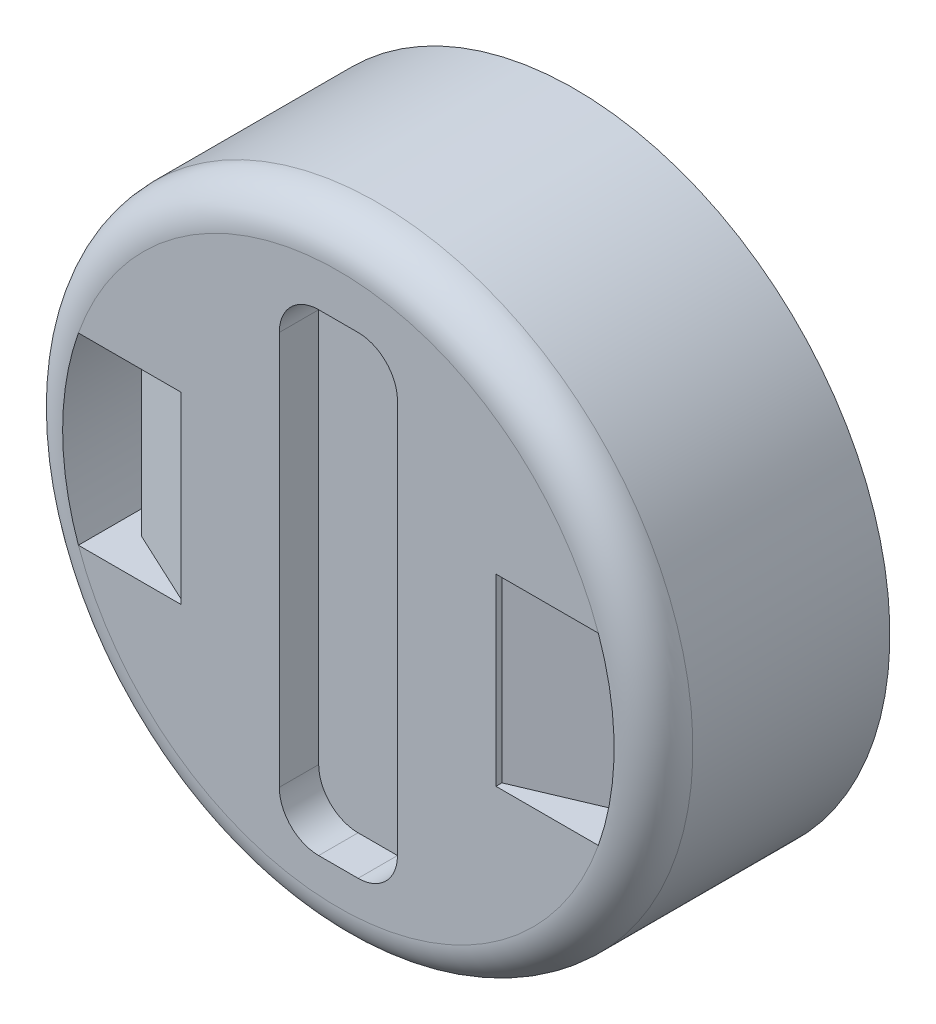
ISO-10303-21;
HEADER;
FILE_DESCRIPTION(('STEP AP214'),'2;1');
FILE_NAME('part.step','',(''),(''),'','','');
FILE_SCHEMA(('AUTOMOTIVE_DESIGN { 1 0 10303 214 1 1 1 1 }'));
ENDSEC;
DATA;
#1=APPLICATION_CONTEXT('core data for automotive mechanical design processes');
#2=APPLICATION_PROTOCOL_DEFINITION('international standard','automotive_design',2000,#1);
#3=PRODUCT_CONTEXT('',#1,'mechanical');
#4=PRODUCT('Part','Part','',(#3));
#5=PRODUCT_RELATED_PRODUCT_CATEGORY('part','',(#4));
#6=PRODUCT_DEFINITION_FORMATION('','',#4);
#7=PRODUCT_DEFINITION_CONTEXT('part definition',#1,'design');
#8=PRODUCT_DEFINITION('design','',#6,#7);
#9=PRODUCT_DEFINITION_SHAPE('','',#8);
#10=(LENGTH_UNIT() NAMED_UNIT(*) SI_UNIT(.MILLI.,.METRE.));
#11=(NAMED_UNIT(*) PLANE_ANGLE_UNIT() SI_UNIT($,.RADIAN.));
#12=(NAMED_UNIT(*) SI_UNIT($,.STERADIAN.) SOLID_ANGLE_UNIT());
#13=UNCERTAINTY_MEASURE_WITH_UNIT(LENGTH_MEASURE(1.E-05),#10,'distance_accuracy_value','');
#14=(GEOMETRIC_REPRESENTATION_CONTEXT(3) GLOBAL_UNCERTAINTY_ASSIGNED_CONTEXT((#13)) GLOBAL_UNIT_ASSIGNED_CONTEXT((#10,
#11,#12)) REPRESENTATION_CONTEXT('',''));
#15=CARTESIAN_POINT('',(0.,0.,0.));
#16=DIRECTION('',(0.,0.,1.));
#17=DIRECTION('',(1.,0.,0.));
#18=AXIS2_PLACEMENT_3D('',#15,#16,#17);
#19=CARTESIAN_POINT('',(4.,2.33333333333333,17.));
#20=DIRECTION('',(0.,1.,0.));
#21=DIRECTION('',(0.,0.,1.));
#22=AXIS2_PLACEMENT_3D('',#19,#20,#21);
#23=PLANE('',#22);
#24=DIRECTION('',(-1.,0.,0.));
#25=VECTOR('',#24,1.);
#26=CARTESIAN_POINT('',(4.,2.33333333333333,16.));
#27=LINE('',#26,#25);
#28=CARTESIAN_POINT('',(6.59966329107444,2.33333333333333,16.));
#29=VERTEX_POINT('',#28);
#30=CARTESIAN_POINT('',(5.99999999999999,2.33333333333333,16.));
#31=VERTEX_POINT('',#30);
#32=EDGE_CURVE('E438',#29,#31,#27,.T.);
#33=ORIENTED_EDGE('',*,*,#32,.F.);
#34=DIRECTION('',(0.,0.,1.));
#35=VECTOR('',#34,1.);
#36=CARTESIAN_POINT('',(6.59966329107444,2.33333333333333,17.));
#37=LINE('',#36,#35);
#38=CARTESIAN_POINT('',(6.59966329107444,2.33333333333333,18.));
#39=VERTEX_POINT('',#38);
#40=EDGE_CURVE('E188',#29,#39,#37,.T.);
#41=ORIENTED_EDGE('',*,*,#40,.T.);
#42=DIRECTION('',(-1.,0.,0.));
#43=VECTOR('',#42,1.);
#44=CARTESIAN_POINT('',(4.,2.33333333333333,18.));
#45=LINE('',#44,#43);
#46=CARTESIAN_POINT('',(4.,2.33333333333333,18.));
#47=VERTEX_POINT('',#46);
#48=EDGE_CURVE('E213',#39,#47,#45,.T.);
#49=ORIENTED_EDGE('',*,*,#48,.T.);
#50=DIRECTION('',(0.,0.,1.));
#51=VECTOR('',#50,1.);
#52=CARTESIAN_POINT('',(4.,2.33333333333333,17.));
#53=LINE('',#52,#51);
#54=CARTESIAN_POINT('',(4.,2.33333333333333,17.8489496324192));
#55=VERTEX_POINT('',#54);
#56=EDGE_CURVE('E217',#55,#47,#53,.T.);
#57=ORIENTED_EDGE('',*,*,#56,.F.);
#58=DIRECTION('',(0.920504853452438,0.,-0.390731128489279));
#59=VECTOR('',#58,1.);
#60=CARTESIAN_POINT('',(5.99999999999999,2.33333333333333,17.));
#61=LINE('',#60,#59);
#62=CARTESIAN_POINT('',(5.99999999999999,2.33333333333333,17.));
#63=VERTEX_POINT('',#62);
#64=EDGE_CURVE('E310',#55,#63,#61,.T.);
#65=ORIENTED_EDGE('',*,*,#64,.T.);
#66=DIRECTION('',(0.,0.,1.));
#67=VECTOR('',#66,1.);
#68=CARTESIAN_POINT('',(5.99999999999999,2.33333333333333,9.));
#69=LINE('',#68,#67);
#70=EDGE_CURVE('E419',#31,#63,#69,.T.);
#71=ORIENTED_EDGE('',*,*,#70,.F.);
#72=EDGE_LOOP('',(#33,#41,#49,#57,#65,#71));
#73=FACE_BOUND('',#72,.T.);
#74=ADVANCED_FACE('F35',(#73),#23,.F.);
#75=CARTESIAN_POINT('',(4.,-2.33333333333333,17.));
#76=DIRECTION('',(0.,-1.,0.));
#77=DIRECTION('',(0.,0.,-1.));
#78=AXIS2_PLACEMENT_3D('',#75,#76,#77);
#79=PLANE('',#78);
#80=DIRECTION('',(1.,0.,0.));
#81=VECTOR('',#80,1.);
#82=CARTESIAN_POINT('',(4.,-2.33333333333333,16.));
#83=LINE('',#82,#81);
#84=CARTESIAN_POINT('',(5.99999999999999,-2.33333333333333,16.));
#85=VERTEX_POINT('',#84);
#86=CARTESIAN_POINT('',(6.59966329107444,-2.33333333333333,16.));
#87=VERTEX_POINT('',#86);
#88=EDGE_CURVE('E448',#85,#87,#83,.T.);
#89=ORIENTED_EDGE('',*,*,#88,.F.);
#90=DIRECTION('',(0.,0.,1.));
#91=VECTOR('',#90,1.);
#92=CARTESIAN_POINT('',(5.99999999999999,-2.33333333333333,9.));
#93=LINE('',#92,#91);
#94=CARTESIAN_POINT('',(5.99999999999999,-2.33333333333333,17.));
#95=VERTEX_POINT('',#94);
#96=EDGE_CURVE('E446',#85,#95,#93,.T.);
#97=ORIENTED_EDGE('',*,*,#96,.T.);
#98=DIRECTION('',(-0.920504853452438,0.,0.390731128489279));
#99=VECTOR('',#98,1.);
#100=CARTESIAN_POINT('',(5.99999999999999,-2.33333333333333,17.));
#101=LINE('',#100,#99);
#102=CARTESIAN_POINT('',(4.,-2.33333333333333,17.8489496324192));
#103=VERTEX_POINT('',#102);
#104=EDGE_CURVE('E307',#95,#103,#101,.T.);
#105=ORIENTED_EDGE('',*,*,#104,.T.);
#106=DIRECTION('',(0.,0.,1.));
#107=VECTOR('',#106,1.);
#108=CARTESIAN_POINT('',(4.,-2.33333333333333,17.));
#109=LINE('',#108,#107);
#110=CARTESIAN_POINT('',(4.,-2.33333333333333,18.));
#111=VERTEX_POINT('',#110);
#112=EDGE_CURVE('E216',#103,#111,#109,.T.);
#113=ORIENTED_EDGE('',*,*,#112,.T.);
#114=DIRECTION('',(1.,0.,0.));
#115=VECTOR('',#114,1.);
#116=CARTESIAN_POINT('',(4.,-2.33333333333333,18.));
#117=LINE('',#116,#115);
#118=CARTESIAN_POINT('',(6.59966329107444,-2.33333333333333,18.));
#119=VERTEX_POINT('',#118);
#120=EDGE_CURVE('E207',#111,#119,#117,.T.);
#121=ORIENTED_EDGE('',*,*,#120,.T.);
#122=DIRECTION('',(0.,0.,1.));
#123=VECTOR('',#122,1.);
#124=CARTESIAN_POINT('',(6.59966329107444,-2.33333333333333,17.));
#125=LINE('',#124,#123);
#126=EDGE_CURVE('E221',#87,#119,#125,.T.);
#127=ORIENTED_EDGE('',*,*,#126,.F.);
#128=EDGE_LOOP('',(#89,#97,#105,#113,#121,#127));
#129=FACE_BOUND('',#128,.T.);
#130=ADVANCED_FACE('F339',(#129),#79,.F.);
#131=CARTESIAN_POINT('',(-6.59966329107444,-2.33333333333333,17.));
#132=DIRECTION('',(0.,-1.,0.));
#133=DIRECTION('',(1.,0.,0.));
#134=AXIS2_PLACEMENT_3D('',#131,#132,#133);
#135=PLANE('',#134);
#136=DIRECTION('',(1.,0.,0.));
#137=VECTOR('',#136,1.);
#138=CARTESIAN_POINT('',(-6.59966329107444,-2.33333333333333,16.));
#139=LINE('',#138,#137);
#140=CARTESIAN_POINT('',(-6.59966329107444,-2.33333333333333,16.));
#141=VERTEX_POINT('',#140);
#142=CARTESIAN_POINT('',(-5.99999999999998,-2.33333333333333,16.));
#143=VERTEX_POINT('',#142);
#144=EDGE_CURVE('E50',#141,#143,#139,.T.);
#145=ORIENTED_EDGE('',*,*,#144,.F.);
#146=DIRECTION('',(0.,0.,1.));
#147=VECTOR('',#146,1.);
#148=CARTESIAN_POINT('',(-6.59966329107444,-2.33333333333333,17.));
#149=LINE('',#148,#147);
#150=CARTESIAN_POINT('',(-6.59966329107444,-2.33333333333333,18.));
#151=VERTEX_POINT('',#150);
#152=EDGE_CURVE('E195',#141,#151,#149,.T.);
#153=ORIENTED_EDGE('',*,*,#152,.T.);
#154=DIRECTION('',(1.,0.,0.));
#155=VECTOR('',#154,1.);
#156=CARTESIAN_POINT('',(-6.59966329107444,-2.33333333333333,18.));
#157=LINE('',#156,#155);
#158=CARTESIAN_POINT('',(-4.,-2.33333333333333,18.));
#159=VERTEX_POINT('',#158);
#160=EDGE_CURVE('E200',#151,#159,#157,.T.);
#161=ORIENTED_EDGE('',*,*,#160,.T.);
#162=DIRECTION('',(0.,0.,1.));
#163=VECTOR('',#162,1.);
#164=CARTESIAN_POINT('',(-4.,-2.33333333333333,17.));
#165=LINE('',#164,#163);
#166=CARTESIAN_POINT('',(-4.,-2.33333333333333,17.93261531631));
#167=VERTEX_POINT('',#166);
#168=EDGE_CURVE('E198',#167,#159,#165,.T.);
#169=ORIENTED_EDGE('',*,*,#168,.F.);
#170=DIRECTION('',(-0.906307787036648,0.,-0.422618261740704));
#171=VECTOR('',#170,1.);
#172=CARTESIAN_POINT('',(-5.99999999999998,-2.33333333333333,17.));
#173=LINE('',#172,#171);
#174=CARTESIAN_POINT('',(-5.99999999999998,-2.33333333333333,17.));
#175=VERTEX_POINT('',#174);
#176=EDGE_CURVE('E301',#167,#175,#173,.T.);
#177=ORIENTED_EDGE('',*,*,#176,.T.);
#178=DIRECTION('',(0.,0.,1.));
#179=VECTOR('',#178,1.);
#180=CARTESIAN_POINT('',(-5.99999999999998,-2.33333333333333,9.));
#181=LINE('',#180,#179);
#182=EDGE_CURVE('E447',#143,#175,#181,.T.);
#183=ORIENTED_EDGE('',*,*,#182,.F.);
#184=EDGE_LOOP('',(#145,#153,#161,#169,#177,#183));
#185=FACE_BOUND('',#184,.T.);
#186=ADVANCED_FACE('F345',(#185),#135,.F.);
#187=CARTESIAN_POINT('',(-6.59966329107444,2.33333333333333,17.));
#188=DIRECTION('',(0.,1.,0.));
#189=DIRECTION('',(0.,0.,1.));
#190=AXIS2_PLACEMENT_3D('',#187,#188,#189);
#191=PLANE('',#190);
#192=DIRECTION('',(-1.,0.,0.));
#193=VECTOR('',#192,1.);
#194=CARTESIAN_POINT('',(-6.59966329107444,2.33333333333333,16.));
#195=LINE('',#194,#193);
#196=CARTESIAN_POINT('',(-5.99999999999998,2.33333333333333,16.));
#197=VERTEX_POINT('',#196);
#198=CARTESIAN_POINT('',(-6.59966329107444,2.33333333333333,16.));
#199=VERTEX_POINT('',#198);
#200=EDGE_CURVE('E171',#197,#199,#195,.T.);
#201=ORIENTED_EDGE('',*,*,#200,.F.);
#202=DIRECTION('',(0.,0.,1.));
#203=VECTOR('',#202,1.);
#204=CARTESIAN_POINT('',(-5.99999999999998,2.33333333333333,9.));
#205=LINE('',#204,#203);
#206=CARTESIAN_POINT('',(-5.99999999999998,2.33333333333333,17.));
#207=VERTEX_POINT('',#206);
#208=EDGE_CURVE('E208',#197,#207,#205,.T.);
#209=ORIENTED_EDGE('',*,*,#208,.T.);
#210=DIRECTION('',(0.906307787036648,0.,0.422618261740704));
#211=VECTOR('',#210,1.);
#212=CARTESIAN_POINT('',(-5.99999999999998,2.33333333333333,17.));
#213=LINE('',#212,#211);
#214=CARTESIAN_POINT('',(-4.,2.33333333333333,17.93261531631));
#215=VERTEX_POINT('',#214);
#216=EDGE_CURVE('E297',#207,#215,#213,.T.);
#217=ORIENTED_EDGE('',*,*,#216,.T.);
#218=DIRECTION('',(0.,0.,1.));
#219=VECTOR('',#218,1.);
#220=CARTESIAN_POINT('',(-4.,2.33333333333333,17.));
#221=LINE('',#220,#219);
#222=CARTESIAN_POINT('',(-4.,2.33333333333333,18.));
#223=VERTEX_POINT('',#222);
#224=EDGE_CURVE('E196',#215,#223,#221,.T.);
#225=ORIENTED_EDGE('',*,*,#224,.T.);
#226=DIRECTION('',(-1.,0.,0.));
#227=VECTOR('',#226,1.);
#228=CARTESIAN_POINT('',(-6.59966329107444,2.33333333333333,18.));
#229=LINE('',#228,#227);
#230=CARTESIAN_POINT('',(-6.59966329107444,2.33333333333333,18.));
#231=VERTEX_POINT('',#230);
#232=EDGE_CURVE('E193',#223,#231,#229,.T.);
#233=ORIENTED_EDGE('',*,*,#232,.T.);
#234=DIRECTION('',(0.,0.,1.));
#235=VECTOR('',#234,1.);
#236=CARTESIAN_POINT('',(-6.59966329107444,2.33333333333333,17.));
#237=LINE('',#236,#235);
#238=EDGE_CURVE('E185',#199,#231,#237,.T.);
#239=ORIENTED_EDGE('',*,*,#238,.F.);
#240=EDGE_LOOP('',(#201,#209,#217,#225,#233,#239));
#241=FACE_BOUND('',#240,.T.);
#242=ADVANCED_FACE('F191',(#241),#191,.F.);
#243=CARTESIAN_POINT('',(5.99999999999999,2.33333333333333,9.));
#244=DIRECTION('',(-1.,0.,0.));
#245=DIRECTION('',(0.,0.,1.));
#246=AXIS2_PLACEMENT_3D('',#243,#244,#245);
#247=PLANE('',#246);
#248=DIRECTION('',(0.,-1.,0.));
#249=VECTOR('',#248,1.);
#250=CARTESIAN_POINT('',(5.99999999999999,2.33333333333333,16.));
#251=LINE('',#250,#249);
#252=EDGE_CURVE('E450',#31,#85,#251,.T.);
#253=ORIENTED_EDGE('',*,*,#252,.F.);
#254=ORIENTED_EDGE('',*,*,#70,.T.);
#255=DIRECTION('',(0.,-1.,0.));
#256=VECTOR('',#255,1.);
#257=CARTESIAN_POINT('',(5.99999999999999,0.,17.));
#258=LINE('',#257,#256);
#259=EDGE_CURVE('E304',#63,#95,#258,.T.);
#260=ORIENTED_EDGE('',*,*,#259,.T.);
#261=ORIENTED_EDGE('',*,*,#96,.F.);
#262=EDGE_LOOP('',(#253,#254,#260,#261));
#263=FACE_BOUND('',#262,.T.);
#264=ADVANCED_FACE('F334',(#263),#247,.F.);
#265=CARTESIAN_POINT('',(-5.99999999999998,-2.33333333333333,9.));
#266=DIRECTION('',(1.,0.,0.));
#267=DIRECTION('',(0.,0.,-1.));
#268=AXIS2_PLACEMENT_3D('',#265,#266,#267);
#269=PLANE('',#268);
#270=DIRECTION('',(0.,1.,0.));
#271=VECTOR('',#270,1.);
#272=CARTESIAN_POINT('',(-5.99999999999998,-2.33333333333333,16.));
#273=LINE('',#272,#271);
#274=EDGE_CURVE('E11',#143,#197,#273,.T.);
#275=ORIENTED_EDGE('',*,*,#274,.F.);
#276=ORIENTED_EDGE('',*,*,#182,.T.);
#277=DIRECTION('',(0.,1.,0.));
#278=VECTOR('',#277,1.);
#279=CARTESIAN_POINT('',(-5.99999999999998,0.,17.));
#280=LINE('',#279,#278);
#281=EDGE_CURVE('E294',#175,#207,#280,.T.);
#282=ORIENTED_EDGE('',*,*,#281,.T.);
#283=ORIENTED_EDGE('',*,*,#208,.F.);
#284=EDGE_LOOP('',(#275,#276,#282,#283));
#285=FACE_BOUND('',#284,.T.);
#286=ADVANCED_FACE('F325',(#285),#269,.F.);
#287=CARTESIAN_POINT('',(0.,0.,18.));
#288=DIRECTION('',(0.,0.,-1.));
#289=DIRECTION('',(-1.,0.,0.));
#290=AXIS2_PLACEMENT_3D('',#287,#288,#289);
#291=CYLINDRICAL_SURFACE('',#290,8.);
#292=CARTESIAN_POINT('',(0.,0.,17.));
#293=DIRECTION('',(0.,0.,-1.));
#294=DIRECTION('',(-1.,0.,0.));
#295=AXIS2_PLACEMENT_3D('',#292,#293,#294);
#296=CIRCLE('',#295,8.);
#297=CARTESIAN_POINT('',(-8.,0.,17.));
#298=VERTEX_POINT('',#297);
#299=EDGE_CURVE('E251',#298,#298,#296,.T.);
#300=ORIENTED_EDGE('',*,*,#299,.T.);
#301=EDGE_LOOP('',(#300));
#302=FACE_BOUND('',#301,.T.);
#303=CARTESIAN_POINT('',(0.,0.,12.));
#304=DIRECTION('',(0.,0.,-1.));
#305=DIRECTION('',(-1.,0.,0.));
#306=AXIS2_PLACEMENT_3D('',#303,#304,#305);
#307=CIRCLE('',#306,8.);
#308=CARTESIAN_POINT('',(-8.,0.,12.));
#309=VERTEX_POINT('',#308);
#310=EDGE_CURVE('E237',#309,#309,#307,.T.);
#311=ORIENTED_EDGE('',*,*,#310,.F.);
#312=EDGE_LOOP('',(#311));
#313=FACE_BOUND('',#312,.T.);
#314=ADVANCED_FACE('F323',(#302,#313),#291,.T.);
#315=CARTESIAN_POINT('',(0.,0.,18.));
#316=DIRECTION('',(0.,0.,-1.));
#317=DIRECTION('',(-1.,0.,0.));
#318=AXIS2_PLACEMENT_3D('',#315,#316,#317);
#319=PLANE('',#318);
#320=DIRECTION('',(1.,0.,0.));
#321=VECTOR('',#320,1.);
#322=CARTESIAN_POINT('',(-1.5,-6.10540648566572,18.));
#323=LINE('',#322,#321);
#324=CARTESIAN_POINT('',(-0.499999999999998,-6.10540648566572,18.));
#325=VERTEX_POINT('',#324);
#326=CARTESIAN_POINT('',(0.500000000000001,-6.10540648566572,18.));
#327=VERTEX_POINT('',#326);
#328=EDGE_CURVE('E241',#325,#327,#323,.T.);
#329=ORIENTED_EDGE('',*,*,#328,.F.);
#330=CARTESIAN_POINT('',(-0.499999999999998,-5.10540648566572,18.));
#331=DIRECTION('',(0.,0.,-1.));
#332=DIRECTION('',(-1.,0.,0.));
#333=AXIS2_PLACEMENT_3D('',#330,#331,#332);
#334=CIRCLE('',#333,1.);
#335=CARTESIAN_POINT('',(-1.5,-5.10540648566572,18.));
#336=VERTEX_POINT('',#335);
#337=EDGE_CURVE('E288',#325,#336,#334,.T.);
#338=ORIENTED_EDGE('',*,*,#337,.T.);
#339=DIRECTION('',(0.,-1.,0.));
#340=VECTOR('',#339,1.);
#341=CARTESIAN_POINT('',(-1.5,5.89459351433428,18.));
#342=LINE('',#341,#340);
#343=CARTESIAN_POINT('',(-1.5,4.89459351433428,18.));
#344=VERTEX_POINT('',#343);
#345=EDGE_CURVE('E238',#344,#336,#342,.T.);
#346=ORIENTED_EDGE('',*,*,#345,.F.);
#347=CARTESIAN_POINT('',(-0.5,4.89459351433428,18.));
#348=DIRECTION('',(0.,0.,-1.));
#349=DIRECTION('',(-1.,0.,0.));
#350=AXIS2_PLACEMENT_3D('',#347,#348,#349);
#351=CIRCLE('',#350,1.);
#352=CARTESIAN_POINT('',(-0.5,5.89459351433428,18.));
#353=VERTEX_POINT('',#352);
#354=EDGE_CURVE('E292',#344,#353,#351,.T.);
#355=ORIENTED_EDGE('',*,*,#354,.T.);
#356=DIRECTION('',(-1.,0.,0.));
#357=VECTOR('',#356,1.);
#358=CARTESIAN_POINT('',(-1.5,5.89459351433428,18.));
#359=LINE('',#358,#357);
#360=CARTESIAN_POINT('',(0.5,5.89459351433428,18.));
#361=VERTEX_POINT('',#360);
#362=EDGE_CURVE('E228',#361,#353,#359,.T.);
#363=ORIENTED_EDGE('',*,*,#362,.F.);
#364=CARTESIAN_POINT('',(0.5,4.89459351433428,18.));
#365=DIRECTION('',(0.,0.,-1.));
#366=DIRECTION('',(-1.,0.,0.));
#367=AXIS2_PLACEMENT_3D('',#364,#365,#366);
#368=CIRCLE('',#367,1.);
#369=CARTESIAN_POINT('',(1.5,4.89459351433428,18.));
#370=VERTEX_POINT('',#369);
#371=EDGE_CURVE('E290',#361,#370,#368,.T.);
#372=ORIENTED_EDGE('',*,*,#371,.T.);
#373=DIRECTION('',(0.,1.,0.));
#374=VECTOR('',#373,1.);
#375=CARTESIAN_POINT('',(1.5,5.89459351433428,18.));
#376=LINE('',#375,#374);
#377=CARTESIAN_POINT('',(1.5,-5.10540648566572,18.));
#378=VERTEX_POINT('',#377);
#379=EDGE_CURVE('E244',#378,#370,#376,.T.);
#380=ORIENTED_EDGE('',*,*,#379,.F.);
#381=CARTESIAN_POINT('',(0.500000000000001,-5.10540648566572,18.));
#382=DIRECTION('',(0.,0.,-1.));
#383=DIRECTION('',(-1.,0.,0.));
#384=AXIS2_PLACEMENT_3D('',#381,#382,#383);
#385=CIRCLE('',#384,1.);
#386=EDGE_CURVE('E286',#378,#327,#385,.T.);
#387=ORIENTED_EDGE('',*,*,#386,.T.);
#388=EDGE_LOOP('',(#329,#338,#346,#355,#363,#372,#380,#387));
#389=FACE_BOUND('',#388,.T.);
#390=DIRECTION('',(0.,1.,0.));
#391=VECTOR('',#390,1.);
#392=CARTESIAN_POINT('',(-4.,2.33333333333333,18.));
#393=LINE('',#392,#391);
#394=EDGE_CURVE('E219',#159,#223,#393,.T.);
#395=ORIENTED_EDGE('',*,*,#394,.F.);
#396=ORIENTED_EDGE('',*,*,#160,.F.);
#397=CARTESIAN_POINT('',(0.,0.,18.));
#398=DIRECTION('',(0.,0.,-1.));
#399=DIRECTION('',(-1.,0.,0.));
#400=AXIS2_PLACEMENT_3D('',#397,#398,#399);
#401=CIRCLE('',#400,7.);
#402=EDGE_CURVE('E255',#151,#119,#401,.F.);
#403=ORIENTED_EDGE('',*,*,#402,.T.);
#404=ORIENTED_EDGE('',*,*,#120,.F.);
#405=DIRECTION('',(0.,-1.,0.));
#406=VECTOR('',#405,1.);
#407=CARTESIAN_POINT('',(4.,2.33333333333333,18.));
#408=LINE('',#407,#406);
#409=EDGE_CURVE('E204',#47,#111,#408,.T.);
#410=ORIENTED_EDGE('',*,*,#409,.F.);
#411=ORIENTED_EDGE('',*,*,#48,.F.);
#412=EDGE_CURVE('E254',#39,#231,#401,.F.);
#413=ORIENTED_EDGE('',*,*,#412,.T.);
#414=ORIENTED_EDGE('',*,*,#232,.F.);
#415=EDGE_LOOP('',(#395,#396,#403,#404,#410,#411,#413,#414));
#416=FACE_BOUND('',#415,.T.);
#417=ADVANCED_FACE('F319',(#389,#416),#319,.F.);
#418=CARTESIAN_POINT('',(0.,0.,12.));
#419=DIRECTION('',(0.,0.,-1.));
#420=DIRECTION('',(-1.,0.,0.));
#421=AXIS2_PLACEMENT_3D('',#418,#419,#420);
#422=PLANE('',#421);
#423=CARTESIAN_POINT('',(0.,0.,12.));
#424=DIRECTION('',(0.,0.,-1.));
#425=DIRECTION('',(-1.,0.,0.));
#426=AXIS2_PLACEMENT_3D('',#423,#424,#425);
#427=CIRCLE('',#426,7.);
#428=CARTESIAN_POINT('',(-7.,0.,12.));
#429=VERTEX_POINT('',#428);
#430=EDGE_CURVE('E44',#429,#429,#427,.T.);
#431=ORIENTED_EDGE('',*,*,#430,.F.);
#432=EDGE_LOOP('',(#431));
#433=FACE_BOUND('',#432,.T.);
#434=ORIENTED_EDGE('',*,*,#310,.T.);
#435=EDGE_LOOP('',(#434));
#436=FACE_BOUND('',#435,.T.);
#437=ADVANCED_FACE('F315',(#433,#436),#422,.T.);
#438=CARTESIAN_POINT('',(0.,0.,17.));
#439=DIRECTION('',(0.,0.,-1.));
#440=DIRECTION('',(-1.,0.,0.));
#441=AXIS2_PLACEMENT_3D('',#438,#439,#440);
#442=TOROIDAL_SURFACE('',#441,7.,1.);
#443=ORIENTED_EDGE('',*,*,#402,.F.);
#444=CARTESIAN_POINT('',(0.,0.,18.));
#445=DIRECTION('',(0.,0.,1.));
#446=DIRECTION('',(1.,0.,0.));
#447=AXIS2_PLACEMENT_3D('',#444,#445,#446);
#448=CIRCLE('',#447,7.);
#449=EDGE_CURVE('E416',#231,#151,#448,.T.);
#450=ORIENTED_EDGE('',*,*,#449,.F.);
#451=ORIENTED_EDGE('',*,*,#412,.F.);
#452=CARTESIAN_POINT('',(0.,0.,18.));
#453=DIRECTION('',(0.,0.,1.));
#454=DIRECTION('',(1.,0.,0.));
#455=AXIS2_PLACEMENT_3D('',#452,#453,#454);
#456=CIRCLE('',#455,7.);
#457=EDGE_CURVE('E211',#119,#39,#456,.T.);
#458=ORIENTED_EDGE('',*,*,#457,.F.);
#459=EDGE_LOOP('',(#443,#450,#451,#458));
#460=FACE_BOUND('',#459,.T.);
#461=ORIENTED_EDGE('',*,*,#299,.F.);
#462=EDGE_LOOP('',(#461));
#463=FACE_BOUND('',#462,.T.);
#464=ADVANCED_FACE('F318',(#460,#463),#442,.T.);
#465=CARTESIAN_POINT('',(-1.5,5.89459351433428,17.));
#466=DIRECTION('',(-1.,0.,0.));
#467=DIRECTION('',(0.,-1.,0.));
#468=AXIS2_PLACEMENT_3D('',#465,#466,#467);
#469=PLANE('',#468);
#470=ORIENTED_EDGE('',*,*,#345,.T.);
#471=DIRECTION('',(0.,0.,1.));
#472=VECTOR('',#471,1.);
#473=CARTESIAN_POINT('',(-1.5,-5.10540648566572,17.));
#474=LINE('',#473,#472);
#475=CARTESIAN_POINT('',(-1.5,-5.10540648566572,17.));
#476=VERTEX_POINT('',#475);
#477=EDGE_CURVE('E279',#336,#476,#474,.F.);
#478=ORIENTED_EDGE('',*,*,#477,.T.);
#479=DIRECTION('',(0.,-1.,0.));
#480=VECTOR('',#479,1.);
#481=CARTESIAN_POINT('',(-1.5,5.89459351433428,17.));
#482=LINE('',#481,#480);
#483=CARTESIAN_POINT('',(-1.5,4.89459351433428,17.));
#484=VERTEX_POINT('',#483);
#485=EDGE_CURVE('E224',#484,#476,#482,.T.);
#486=ORIENTED_EDGE('',*,*,#485,.F.);
#487=DIRECTION('',(0.,0.,1.));
#488=VECTOR('',#487,1.);
#489=CARTESIAN_POINT('',(-1.5,4.89459351433428,18.));
#490=LINE('',#489,#488);
#491=EDGE_CURVE('E276',#484,#344,#490,.T.);
#492=ORIENTED_EDGE('',*,*,#491,.T.);
#493=EDGE_LOOP('',(#470,#478,#486,#492));
#494=FACE_BOUND('',#493,.T.);
#495=ADVANCED_FACE('F366',(#494),#469,.F.);
#496=CARTESIAN_POINT('',(-1.5,5.89459351433428,17.));
#497=DIRECTION('',(0.,1.,0.));
#498=DIRECTION('',(0.,0.,1.));
#499=AXIS2_PLACEMENT_3D('',#496,#497,#498);
#500=PLANE('',#499);
#501=DIRECTION('',(-1.,0.,0.));
#502=VECTOR('',#501,1.);
#503=CARTESIAN_POINT('',(-1.5,5.89459351433428,17.));
#504=LINE('',#503,#502);
#505=CARTESIAN_POINT('',(0.5,5.89459351433428,17.));
#506=VERTEX_POINT('',#505);
#507=CARTESIAN_POINT('',(-0.5,5.89459351433428,17.));
#508=VERTEX_POINT('',#507);
#509=EDGE_CURVE('E234',#506,#508,#504,.T.);
#510=ORIENTED_EDGE('',*,*,#509,.F.);
#511=DIRECTION('',(0.,0.,1.));
#512=VECTOR('',#511,1.);
#513=CARTESIAN_POINT('',(0.5,5.89459351433428,18.));
#514=LINE('',#513,#512);
#515=EDGE_CURVE('E283',#506,#361,#514,.T.);
#516=ORIENTED_EDGE('',*,*,#515,.T.);
#517=ORIENTED_EDGE('',*,*,#362,.T.);
#518=DIRECTION('',(0.,0.,1.));
#519=VECTOR('',#518,1.);
#520=CARTESIAN_POINT('',(-0.5,5.89459351433428,17.));
#521=LINE('',#520,#519);
#522=EDGE_CURVE('E281',#353,#508,#521,.F.);
#523=ORIENTED_EDGE('',*,*,#522,.T.);
#524=EDGE_LOOP('',(#510,#516,#517,#523));
#525=FACE_BOUND('',#524,.T.);
#526=ADVANCED_FACE('F362',(#525),#500,.F.);
#527=CARTESIAN_POINT('',(1.5,5.89459351433428,17.));
#528=DIRECTION('',(1.,0.,0.));
#529=DIRECTION('',(0.,1.,0.));
#530=AXIS2_PLACEMENT_3D('',#527,#528,#529);
#531=PLANE('',#530);
#532=DIRECTION('',(0.,1.,0.));
#533=VECTOR('',#532,1.);
#534=CARTESIAN_POINT('',(1.5,5.89459351433428,17.));
#535=LINE('',#534,#533);
#536=CARTESIAN_POINT('',(1.5,-5.10540648566572,17.));
#537=VERTEX_POINT('',#536);
#538=CARTESIAN_POINT('',(1.5,4.89459351433428,17.));
#539=VERTEX_POINT('',#538);
#540=EDGE_CURVE('E231',#537,#539,#535,.T.);
#541=ORIENTED_EDGE('',*,*,#540,.F.);
#542=DIRECTION('',(0.,0.,1.));
#543=VECTOR('',#542,1.);
#544=CARTESIAN_POINT('',(1.5,-5.10540648566572,18.));
#545=LINE('',#544,#543);
#546=EDGE_CURVE('E260',#537,#378,#545,.T.);
#547=ORIENTED_EDGE('',*,*,#546,.T.);
#548=ORIENTED_EDGE('',*,*,#379,.T.);
#549=DIRECTION('',(0.,0.,1.));
#550=VECTOR('',#549,1.);
#551=CARTESIAN_POINT('',(1.5,4.89459351433428,17.));
#552=LINE('',#551,#550);
#553=EDGE_CURVE('E258',#370,#539,#552,.F.);
#554=ORIENTED_EDGE('',*,*,#553,.T.);
#555=EDGE_LOOP('',(#541,#547,#548,#554));
#556=FACE_BOUND('',#555,.T.);
#557=ADVANCED_FACE('F365',(#556),#531,.F.);
#558=CARTESIAN_POINT('',(-1.5,-6.10540648566572,17.));
#559=DIRECTION('',(0.,-1.,0.));
#560=DIRECTION('',(0.,0.,-1.));
#561=AXIS2_PLACEMENT_3D('',#558,#559,#560);
#562=PLANE('',#561);
#563=ORIENTED_EDGE('',*,*,#328,.T.);
#564=DIRECTION('',(0.,0.,1.));
#565=VECTOR('',#564,1.);
#566=CARTESIAN_POINT('',(0.500000000000001,-6.10540648566572,17.));
#567=LINE('',#566,#565);
#568=CARTESIAN_POINT('',(0.500000000000001,-6.10540648566572,17.));
#569=VERTEX_POINT('',#568);
#570=EDGE_CURVE('E266',#327,#569,#567,.F.);
#571=ORIENTED_EDGE('',*,*,#570,.T.);
#572=DIRECTION('',(1.,0.,0.));
#573=VECTOR('',#572,1.);
#574=CARTESIAN_POINT('',(-1.5,-6.10540648566572,17.));
#575=LINE('',#574,#573);
#576=CARTESIAN_POINT('',(-0.499999999999998,-6.10540648566572,17.));
#577=VERTEX_POINT('',#576);
#578=EDGE_CURVE('E227',#577,#569,#575,.T.);
#579=ORIENTED_EDGE('',*,*,#578,.F.);
#580=DIRECTION('',(0.,0.,1.));
#581=VECTOR('',#580,1.);
#582=CARTESIAN_POINT('',(-0.499999999999998,-6.10540648566572,18.));
#583=LINE('',#582,#581);
#584=EDGE_CURVE('E263',#577,#325,#583,.T.);
#585=ORIENTED_EDGE('',*,*,#584,.T.);
#586=EDGE_LOOP('',(#563,#571,#579,#585));
#587=FACE_BOUND('',#586,.T.);
#588=ADVANCED_FACE('F360',(#587),#562,.F.);
#589=CARTESIAN_POINT('',(0.,0.,17.));
#590=DIRECTION('',(0.,0.,1.));
#591=DIRECTION('',(1.,0.,0.));
#592=AXIS2_PLACEMENT_3D('',#589,#590,#591);
#593=PLANE('',#592);
#594=ORIENTED_EDGE('',*,*,#578,.T.);
#595=CARTESIAN_POINT('',(0.500000000000001,-5.10540648566572,17.));
#596=DIRECTION('',(0.,0.,1.));
#597=DIRECTION('',(1.,0.,0.));
#598=AXIS2_PLACEMENT_3D('',#595,#596,#597);
#599=CIRCLE('',#598,1.);
#600=EDGE_CURVE('E274',#569,#537,#599,.T.);
#601=ORIENTED_EDGE('',*,*,#600,.T.);
#602=ORIENTED_EDGE('',*,*,#540,.T.);
#603=CARTESIAN_POINT('',(0.5,4.89459351433428,17.));
#604=DIRECTION('',(0.,0.,1.));
#605=DIRECTION('',(1.,0.,0.));
#606=AXIS2_PLACEMENT_3D('',#603,#604,#605);
#607=CIRCLE('',#606,1.);
#608=EDGE_CURVE('E270',#539,#506,#607,.T.);
#609=ORIENTED_EDGE('',*,*,#608,.T.);
#610=ORIENTED_EDGE('',*,*,#509,.T.);
#611=CARTESIAN_POINT('',(-0.5,4.89459351433428,17.));
#612=DIRECTION('',(0.,0.,1.));
#613=DIRECTION('',(1.,0.,0.));
#614=AXIS2_PLACEMENT_3D('',#611,#612,#613);
#615=CIRCLE('',#614,1.);
#616=EDGE_CURVE('E268',#508,#484,#615,.T.);
#617=ORIENTED_EDGE('',*,*,#616,.T.);
#618=ORIENTED_EDGE('',*,*,#485,.T.);
#619=CARTESIAN_POINT('',(-0.499999999999998,-5.10540648566572,17.));
#620=DIRECTION('',(0.,0.,1.));
#621=DIRECTION('',(1.,0.,0.));
#622=AXIS2_PLACEMENT_3D('',#619,#620,#621);
#623=CIRCLE('',#622,1.);
#624=EDGE_CURVE('E272',#476,#577,#623,.T.);
#625=ORIENTED_EDGE('',*,*,#624,.T.);
#626=EDGE_LOOP('',(#594,#601,#602,#609,#610,#617,#618,#625));
#627=FACE_BOUND('',#626,.T.);
#628=ADVANCED_FACE('F356',(#627),#593,.T.);
#629=CARTESIAN_POINT('',(0.500000000000001,-5.10540648566572,17.));
#630=DIRECTION('',(0.,0.,-1.));
#631=DIRECTION('',(-1.,0.,0.));
#632=AXIS2_PLACEMENT_3D('',#629,#630,#631);
#633=CYLINDRICAL_SURFACE('',#632,1.);
#634=ORIENTED_EDGE('',*,*,#600,.F.);
#635=ORIENTED_EDGE('',*,*,#570,.F.);
#636=ORIENTED_EDGE('',*,*,#386,.F.);
#637=ORIENTED_EDGE('',*,*,#546,.F.);
#638=EDGE_LOOP('',(#634,#635,#636,#637));
#639=FACE_BOUND('',#638,.T.);
#640=ADVANCED_FACE('F359',(#639),#633,.F.);
#641=CARTESIAN_POINT('',(-0.499999999999998,-5.10540648566572,17.));
#642=DIRECTION('',(0.,0.,-1.));
#643=DIRECTION('',(-1.,0.,0.));
#644=AXIS2_PLACEMENT_3D('',#641,#642,#643);
#645=CYLINDRICAL_SURFACE('',#644,1.);
#646=ORIENTED_EDGE('',*,*,#624,.F.);
#647=ORIENTED_EDGE('',*,*,#477,.F.);
#648=ORIENTED_EDGE('',*,*,#337,.F.);
#649=ORIENTED_EDGE('',*,*,#584,.F.);
#650=EDGE_LOOP('',(#646,#647,#648,#649));
#651=FACE_BOUND('',#650,.T.);
#652=ADVANCED_FACE('F386',(#651),#645,.F.);
#653=CARTESIAN_POINT('',(0.5,4.89459351433428,17.));
#654=DIRECTION('',(0.,0.,-1.));
#655=DIRECTION('',(-1.,0.,0.));
#656=AXIS2_PLACEMENT_3D('',#653,#654,#655);
#657=CYLINDRICAL_SURFACE('',#656,1.);
#658=ORIENTED_EDGE('',*,*,#608,.F.);
#659=ORIENTED_EDGE('',*,*,#553,.F.);
#660=ORIENTED_EDGE('',*,*,#371,.F.);
#661=ORIENTED_EDGE('',*,*,#515,.F.);
#662=EDGE_LOOP('',(#658,#659,#660,#661));
#663=FACE_BOUND('',#662,.T.);
#664=ADVANCED_FACE('F399',(#663),#657,.F.);
#665=CARTESIAN_POINT('',(-0.5,4.89459351433428,17.));
#666=DIRECTION('',(0.,0.,-1.));
#667=DIRECTION('',(-1.,0.,0.));
#668=AXIS2_PLACEMENT_3D('',#665,#666,#667);
#669=CYLINDRICAL_SURFACE('',#668,1.);
#670=ORIENTED_EDGE('',*,*,#616,.F.);
#671=ORIENTED_EDGE('',*,*,#522,.F.);
#672=ORIENTED_EDGE('',*,*,#354,.F.);
#673=ORIENTED_EDGE('',*,*,#491,.F.);
#674=EDGE_LOOP('',(#670,#671,#672,#673));
#675=FACE_BOUND('',#674,.T.);
#676=ADVANCED_FACE('F355',(#675),#669,.F.);
#677=CARTESIAN_POINT('',(4.,2.33333333333333,17.));
#678=DIRECTION('',(-1.,0.,0.));
#679=DIRECTION('',(0.,0.,1.));
#680=AXIS2_PLACEMENT_3D('',#677,#678,#679);
#681=PLANE('',#680);
#682=ORIENTED_EDGE('',*,*,#112,.F.);
#683=DIRECTION('',(0.,1.,0.));
#684=VECTOR('',#683,1.);
#685=CARTESIAN_POINT('',(4.,2.33333333333333,17.8489496324192));
#686=LINE('',#685,#684);
#687=EDGE_CURVE('E58',#103,#55,#686,.T.);
#688=ORIENTED_EDGE('',*,*,#687,.T.);
#689=ORIENTED_EDGE('',*,*,#56,.T.);
#690=ORIENTED_EDGE('',*,*,#409,.T.);
#691=EDGE_LOOP('',(#682,#688,#689,#690));
#692=FACE_BOUND('',#691,.T.);
#693=ADVANCED_FACE('F352',(#692),#681,.F.);
#694=CARTESIAN_POINT('',(-4.,2.33333333333333,17.));
#695=DIRECTION('',(1.,0.,0.));
#696=DIRECTION('',(0.,0.,-1.));
#697=AXIS2_PLACEMENT_3D('',#694,#695,#696);
#698=PLANE('',#697);
#699=ORIENTED_EDGE('',*,*,#224,.F.);
#700=DIRECTION('',(0.,-1.,0.));
#701=VECTOR('',#700,1.);
#702=CARTESIAN_POINT('',(-4.,2.33333333333333,17.93261531631));
#703=LINE('',#702,#701);
#704=EDGE_CURVE('E299',#215,#167,#703,.T.);
#705=ORIENTED_EDGE('',*,*,#704,.T.);
#706=ORIENTED_EDGE('',*,*,#168,.T.);
#707=ORIENTED_EDGE('',*,*,#394,.T.);
#708=EDGE_LOOP('',(#699,#705,#706,#707));
#709=FACE_BOUND('',#708,.T.);
#710=ADVANCED_FACE('F349',(#709),#698,.F.);
#711=CARTESIAN_POINT('',(0.,0.,17.));
#712=DIRECTION('',(0.,0.,1.));
#713=DIRECTION('',(1.,0.,0.));
#714=AXIS2_PLACEMENT_3D('',#711,#712,#713);
#715=CYLINDRICAL_SURFACE('',#714,7.);
#716=ORIENTED_EDGE('',*,*,#40,.F.);
#717=CARTESIAN_POINT('',(0.,0.,16.));
#718=DIRECTION('',(0.,0.,-1.));
#719=DIRECTION('',(-1.,0.,0.));
#720=AXIS2_PLACEMENT_3D('',#717,#718,#719);
#721=CIRCLE('',#720,7.);
#722=EDGE_CURVE('E174',#199,#29,#721,.T.);
#723=ORIENTED_EDGE('',*,*,#722,.F.);
#724=ORIENTED_EDGE('',*,*,#238,.T.);
#725=ORIENTED_EDGE('',*,*,#449,.T.);
#726=ORIENTED_EDGE('',*,*,#152,.F.);
#727=EDGE_CURVE('E189',#87,#141,#721,.T.);
#728=ORIENTED_EDGE('',*,*,#727,.F.);
#729=ORIENTED_EDGE('',*,*,#126,.T.);
#730=ORIENTED_EDGE('',*,*,#457,.T.);
#731=EDGE_LOOP('',(#716,#723,#724,#725,#726,#728,#729,#730));
#732=FACE_BOUND('',#731,.T.);
#733=ORIENTED_EDGE('',*,*,#430,.T.);
#734=EDGE_LOOP('',(#733));
#735=FACE_BOUND('',#734,.T.);
#736=ADVANCED_FACE('F182',(#732,#735),#715,.F.);
#737=CARTESIAN_POINT('',(-5.99999999999998,0.,17.));
#738=DIRECTION('',(0.422618261740704,0.,-0.906307787036648));
#739=DIRECTION('',(0.,1.,0.));
#740=AXIS2_PLACEMENT_3D('',#737,#738,#739);
#741=PLANE('',#740);
#742=ORIENTED_EDGE('',*,*,#176,.F.);
#743=ORIENTED_EDGE('',*,*,#704,.F.);
#744=ORIENTED_EDGE('',*,*,#216,.F.);
#745=ORIENTED_EDGE('',*,*,#281,.F.);
#746=EDGE_LOOP('',(#742,#743,#744,#745));
#747=FACE_BOUND('',#746,.T.);
#748=ADVANCED_FACE('F458',(#747),#741,.F.);
#749=CARTESIAN_POINT('',(5.99999999999999,0.,17.));
#750=DIRECTION('',(-0.390731128489279,0.,-0.920504853452438));
#751=DIRECTION('',(0.,-1.,0.));
#752=AXIS2_PLACEMENT_3D('',#749,#750,#751);
#753=PLANE('',#752);
#754=ORIENTED_EDGE('',*,*,#64,.F.);
#755=ORIENTED_EDGE('',*,*,#687,.F.);
#756=ORIENTED_EDGE('',*,*,#104,.F.);
#757=ORIENTED_EDGE('',*,*,#259,.F.);
#758=EDGE_LOOP('',(#754,#755,#756,#757));
#759=FACE_BOUND('',#758,.T.);
#760=ADVANCED_FACE('F38',(#759),#753,.F.);
#761=CARTESIAN_POINT('',(0.,0.,16.));
#762=DIRECTION('',(0.,0.,-1.));
#763=DIRECTION('',(-1.,0.,0.));
#764=AXIS2_PLACEMENT_3D('',#761,#762,#763);
#765=PLANE('',#764);
#766=ORIENTED_EDGE('',*,*,#32,.T.);
#767=ORIENTED_EDGE('',*,*,#252,.T.);
#768=ORIENTED_EDGE('',*,*,#88,.T.);
#769=ORIENTED_EDGE('',*,*,#727,.T.);
#770=ORIENTED_EDGE('',*,*,#144,.T.);
#771=ORIENTED_EDGE('',*,*,#274,.T.);
#772=ORIENTED_EDGE('',*,*,#200,.T.);
#773=ORIENTED_EDGE('',*,*,#722,.T.);
#774=EDGE_LOOP('',(#766,#767,#768,#769,#770,#771,#772,#773));
#775=FACE_BOUND('',#774,.T.);
#776=ADVANCED_FACE('F173',(#775),#765,.T.);
#777=CLOSED_SHELL('',(#74,#130,#186,#242,#264,#286,#314,#417,#437,#464,#495,#526,#557,#588,#628,
#640,#652,#664,#676,#693,#710,#736,#748,#760,#776));
#778=MANIFOLD_SOLID_BREP('B2',#777);
#779=ADVANCED_BREP_SHAPE_REPRESENTATION('',(#18,#778),#14);
#780=SHAPE_DEFINITION_REPRESENTATION(#9,#779);
ENDSEC;
END-ISO-10303-21;
